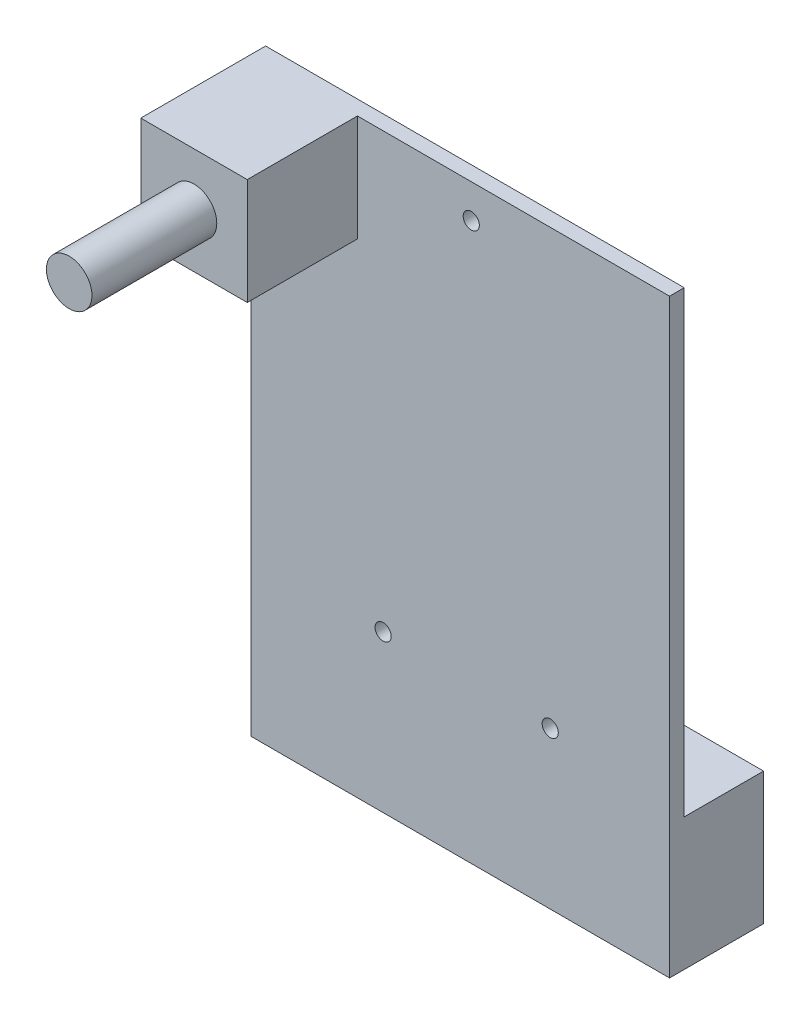
ISO-10303-21;
HEADER;
FILE_DESCRIPTION(('STEP AP214'),'2;1');
FILE_NAME('part.step','',(''),(''),'','','');
FILE_SCHEMA(('AUTOMOTIVE_DESIGN { 1 0 10303 214 1 1 1 1 }'));
ENDSEC;
DATA;
#1=APPLICATION_CONTEXT('core data for automotive mechanical design processes');
#2=APPLICATION_PROTOCOL_DEFINITION('international standard','automotive_design',2000,#1);
#3=PRODUCT_CONTEXT('',#1,'mechanical');
#4=PRODUCT('Part','Part','',(#3));
#5=PRODUCT_RELATED_PRODUCT_CATEGORY('part','',(#4));
#6=PRODUCT_DEFINITION_FORMATION('','',#4);
#7=PRODUCT_DEFINITION_CONTEXT('part definition',#1,'design');
#8=PRODUCT_DEFINITION('design','',#6,#7);
#9=PRODUCT_DEFINITION_SHAPE('','',#8);
#10=(LENGTH_UNIT() NAMED_UNIT(*) SI_UNIT(.MILLI.,.METRE.));
#11=(NAMED_UNIT(*) PLANE_ANGLE_UNIT() SI_UNIT($,.RADIAN.));
#12=(NAMED_UNIT(*) SI_UNIT($,.STERADIAN.) SOLID_ANGLE_UNIT());
#13=UNCERTAINTY_MEASURE_WITH_UNIT(LENGTH_MEASURE(1.E-05),#10,'distance_accuracy_value','');
#14=(GEOMETRIC_REPRESENTATION_CONTEXT(3) GLOBAL_UNCERTAINTY_ASSIGNED_CONTEXT((#13)) GLOBAL_UNIT_ASSIGNED_CONTEXT((#10,
#11,#12)) REPRESENTATION_CONTEXT('',''));
#15=CARTESIAN_POINT('',(0.,0.,0.));
#16=DIRECTION('',(0.,0.,1.));
#17=DIRECTION('',(1.,0.,0.));
#18=AXIS2_PLACEMENT_3D('',#15,#16,#17);
#19=CARTESIAN_POINT('',(-28.5,-40.2,17.));
#20=DIRECTION('',(0.,1.,0.));
#21=DIRECTION('',(0.,0.,1.));
#22=AXIS2_PLACEMENT_3D('',#19,#20,#21);
#23=PLANE('',#22);
#24=DIRECTION('',(1.,0.,0.));
#25=VECTOR('',#24,1.);
#26=CARTESIAN_POINT('',(-28.5,-40.2,2.));
#27=LINE('',#26,#25);
#28=CARTESIAN_POINT('',(-28.5,-40.2,2.));
#29=VERTEX_POINT('',#28);
#30=CARTESIAN_POINT('',(28.5,-40.2,2.));
#31=VERTEX_POINT('',#30);
#32=EDGE_CURVE('E145',#29,#31,#27,.T.);
#33=ORIENTED_EDGE('',*,*,#32,.F.);
#34=DIRECTION('',(0.,0.,-1.));
#35=VECTOR('',#34,1.);
#36=CARTESIAN_POINT('',(-28.5,-40.2,17.));
#37=LINE('',#36,#35);
#38=CARTESIAN_POINT('',(-28.5,-40.2,-10.8));
#39=VERTEX_POINT('',#38);
#40=EDGE_CURVE('E180',#29,#39,#37,.T.);
#41=ORIENTED_EDGE('',*,*,#40,.T.);
#42=DIRECTION('',(1.,0.,0.));
#43=VECTOR('',#42,1.);
#44=CARTESIAN_POINT('',(-28.5,-40.2,-10.8));
#45=LINE('',#44,#43);
#46=CARTESIAN_POINT('',(28.5,-40.2,-10.8));
#47=VERTEX_POINT('',#46);
#48=EDGE_CURVE('E153',#39,#47,#45,.T.);
#49=ORIENTED_EDGE('',*,*,#48,.T.);
#50=DIRECTION('',(0.,0.,-1.));
#51=VECTOR('',#50,1.);
#52=CARTESIAN_POINT('',(28.5,-40.2,17.));
#53=LINE('',#52,#51);
#54=EDGE_CURVE('E12',#31,#47,#53,.T.);
#55=ORIENTED_EDGE('',*,*,#54,.F.);
#56=EDGE_LOOP('',(#33,#41,#49,#55));
#57=FACE_BOUND('',#56,.T.);
#58=ADVANCED_FACE('F49',(#57),#23,.F.);
#59=CARTESIAN_POINT('',(28.5,-40.2,17.));
#60=DIRECTION('',(-1.,0.,0.));
#61=DIRECTION('',(0.,0.,1.));
#62=AXIS2_PLACEMENT_3D('',#59,#60,#61);
#63=PLANE('',#62);
#64=DIRECTION('',(0.,1.,0.));
#65=VECTOR('',#64,1.);
#66=CARTESIAN_POINT('',(28.5,-40.2,2.));
#67=LINE('',#66,#65);
#68=CARTESIAN_POINT('',(28.5,40.2,2.));
#69=VERTEX_POINT('',#68);
#70=EDGE_CURVE('E133',#31,#69,#67,.T.);
#71=ORIENTED_EDGE('',*,*,#70,.F.);
#72=ORIENTED_EDGE('',*,*,#54,.T.);
#73=DIRECTION('',(0.,1.,0.));
#74=VECTOR('',#73,1.);
#75=CARTESIAN_POINT('',(28.5,-40.2,-10.8));
#76=LINE('',#75,#74);
#77=CARTESIAN_POINT('',(28.5,-22.2,-10.8));
#78=VERTEX_POINT('',#77);
#79=EDGE_CURVE('E149',#47,#78,#76,.T.);
#80=ORIENTED_EDGE('',*,*,#79,.T.);
#81=DIRECTION('',(0.,0.,1.));
#82=VECTOR('',#81,1.);
#83=CARTESIAN_POINT('',(28.5,-22.2,-98.3745765355138));
#84=LINE('',#83,#82);
#85=CARTESIAN_POINT('',(28.5,-22.2,0.));
#86=VERTEX_POINT('',#85);
#87=EDGE_CURVE('E161',#78,#86,#84,.T.);
#88=ORIENTED_EDGE('',*,*,#87,.T.);
#89=DIRECTION('',(0.,1.,0.));
#90=VECTOR('',#89,1.);
#91=CARTESIAN_POINT('',(28.5,-40.2,0.));
#92=LINE('',#91,#90);
#93=CARTESIAN_POINT('',(28.5,40.2,0.));
#94=VERTEX_POINT('',#93);
#95=EDGE_CURVE('E172',#86,#94,#92,.T.);
#96=ORIENTED_EDGE('',*,*,#95,.T.);
#97=DIRECTION('',(0.,0.,-1.));
#98=VECTOR('',#97,1.);
#99=CARTESIAN_POINT('',(28.5,40.2,17.));
#100=LINE('',#99,#98);
#101=EDGE_CURVE('E57',#69,#94,#100,.T.);
#102=ORIENTED_EDGE('',*,*,#101,.F.);
#103=EDGE_LOOP('',(#71,#72,#80,#88,#96,#102));
#104=FACE_BOUND('',#103,.T.);
#105=ADVANCED_FACE('F231',(#104),#63,.F.);
#106=CARTESIAN_POINT('',(0.,0.,0.));
#107=DIRECTION('',(0.,0.,1.));
#108=DIRECTION('',(1.,0.,0.));
#109=AXIS2_PLACEMENT_3D('',#106,#107,#108);
#110=PLANE('',#109);
#111=CARTESIAN_POINT('',(1.49999999999999,35.6,0.));
#112=DIRECTION('',(0.,0.,1.));
#113=DIRECTION('',(1.,0.,0.));
#114=AXIS2_PLACEMENT_3D('',#111,#112,#113);
#115=CIRCLE('',#114,1.1);
#116=CARTESIAN_POINT('',(2.59999999999999,35.6,0.));
#117=VERTEX_POINT('',#116);
#118=EDGE_CURVE('E206',#117,#117,#115,.T.);
#119=ORIENTED_EDGE('',*,*,#118,.T.);
#120=EDGE_LOOP('',(#119));
#121=FACE_BOUND('',#120,.T.);
#122=CARTESIAN_POINT('',(-10.5,-18.8772505463019,0.));
#123=DIRECTION('',(0.,0.,1.));
#124=DIRECTION('',(1.,0.,0.));
#125=AXIS2_PLACEMENT_3D('',#122,#123,#124);
#126=CIRCLE('',#125,1.1);
#127=CARTESIAN_POINT('',(-9.40000000000001,-18.8772505463019,0.));
#128=VERTEX_POINT('',#127);
#129=EDGE_CURVE('E196',#128,#128,#126,.T.);
#130=ORIENTED_EDGE('',*,*,#129,.T.);
#131=EDGE_LOOP('',(#130));
#132=FACE_BOUND('',#131,.T.);
#133=CARTESIAN_POINT('',(12.2499992716912,-18.8714939804325,0.));
#134=DIRECTION('',(0.,0.,1.));
#135=DIRECTION('',(1.,0.,0.));
#136=AXIS2_PLACEMENT_3D('',#133,#134,#135);
#137=CIRCLE('',#136,1.1);
#138=CARTESIAN_POINT('',(13.3499992716912,-18.8714939804325,0.));
#139=VERTEX_POINT('',#138);
#140=EDGE_CURVE('E193',#139,#139,#137,.T.);
#141=ORIENTED_EDGE('',*,*,#140,.T.);
#142=EDGE_LOOP('',(#141));
#143=FACE_BOUND('',#142,.T.);
#144=DIRECTION('',(1.,0.,0.));
#145=VECTOR('',#144,1.);
#146=CARTESIAN_POINT('',(-28.5,-22.2,0.));
#147=LINE('',#146,#145);
#148=CARTESIAN_POINT('',(-28.5,-22.2,0.));
#149=VERTEX_POINT('',#148);
#150=EDGE_CURVE('E73',#149,#86,#147,.T.);
#151=ORIENTED_EDGE('',*,*,#150,.F.);
#152=DIRECTION('',(0.,-1.,0.));
#153=VECTOR('',#152,1.);
#154=CARTESIAN_POINT('',(-28.5,-40.2,0.));
#155=LINE('',#154,#153);
#156=CARTESIAN_POINT('',(-28.5,40.2,0.));
#157=VERTEX_POINT('',#156);
#158=EDGE_CURVE('E177',#157,#149,#155,.T.);
#159=ORIENTED_EDGE('',*,*,#158,.F.);
#160=DIRECTION('',(-1.,0.,0.));
#161=VECTOR('',#160,1.);
#162=CARTESIAN_POINT('',(-28.5,40.2,0.));
#163=LINE('',#162,#161);
#164=EDGE_CURVE('E183',#94,#157,#163,.T.);
#165=ORIENTED_EDGE('',*,*,#164,.F.);
#166=ORIENTED_EDGE('',*,*,#95,.F.);
#167=EDGE_LOOP('',(#151,#159,#165,#166));
#168=FACE_BOUND('',#167,.T.);
#169=ADVANCED_FACE('F228',(#121,#132,#143,#168),#110,.F.);
#170=CARTESIAN_POINT('',(-28.5,40.2,17.));
#171=DIRECTION('',(0.,-1.,0.));
#172=DIRECTION('',(0.,0.,-1.));
#173=AXIS2_PLACEMENT_3D('',#170,#171,#172);
#174=PLANE('',#173);
#175=DIRECTION('',(-1.,0.,0.));
#176=VECTOR('',#175,1.);
#177=CARTESIAN_POINT('',(-28.5,40.2,17.));
#178=LINE('',#177,#176);
#179=CARTESIAN_POINT('',(-14.,40.2,17.));
#180=VERTEX_POINT('',#179);
#181=CARTESIAN_POINT('',(-28.5,40.2,17.));
#182=VERTEX_POINT('',#181);
#183=EDGE_CURVE('E141',#180,#182,#178,.T.);
#184=ORIENTED_EDGE('',*,*,#183,.F.);
#185=DIRECTION('',(0.,0.,1.));
#186=VECTOR('',#185,1.);
#187=CARTESIAN_POINT('',(-14.,40.2,2.));
#188=LINE('',#187,#186);
#189=CARTESIAN_POINT('',(-14.,40.2,2.));
#190=VERTEX_POINT('',#189);
#191=EDGE_CURVE('E65',#190,#180,#188,.T.);
#192=ORIENTED_EDGE('',*,*,#191,.F.);
#193=DIRECTION('',(-1.,0.,0.));
#194=VECTOR('',#193,1.);
#195=CARTESIAN_POINT('',(28.5,40.2,2.));
#196=LINE('',#195,#194);
#197=EDGE_CURVE('E128',#69,#190,#196,.T.);
#198=ORIENTED_EDGE('',*,*,#197,.F.);
#199=ORIENTED_EDGE('',*,*,#101,.T.);
#200=ORIENTED_EDGE('',*,*,#164,.T.);
#201=DIRECTION('',(0.,0.,-1.));
#202=VECTOR('',#201,1.);
#203=CARTESIAN_POINT('',(-28.5,40.2,17.));
#204=LINE('',#203,#202);
#205=EDGE_CURVE('E187',#182,#157,#204,.T.);
#206=ORIENTED_EDGE('',*,*,#205,.F.);
#207=EDGE_LOOP('',(#184,#192,#198,#199,#200,#206));
#208=FACE_BOUND('',#207,.T.);
#209=ADVANCED_FACE('F139',(#208),#174,.F.);
#210=CARTESIAN_POINT('',(-28.5,-40.2,17.));
#211=DIRECTION('',(1.,0.,0.));
#212=DIRECTION('',(0.,0.,-1.));
#213=AXIS2_PLACEMENT_3D('',#210,#211,#212);
#214=PLANE('',#213);
#215=DIRECTION('',(0.,-1.,0.));
#216=VECTOR('',#215,1.);
#217=CARTESIAN_POINT('',(-28.5,25.7,2.));
#218=LINE('',#217,#216);
#219=CARTESIAN_POINT('',(-28.5,25.7,2.));
#220=VERTEX_POINT('',#219);
#221=EDGE_CURVE('E211',#220,#29,#218,.T.);
#222=ORIENTED_EDGE('',*,*,#221,.F.);
#223=DIRECTION('',(0.,0.,1.));
#224=VECTOR('',#223,1.);
#225=CARTESIAN_POINT('',(-28.5,25.7,2.));
#226=LINE('',#225,#224);
#227=CARTESIAN_POINT('',(-28.5,25.7,17.));
#228=VERTEX_POINT('',#227);
#229=EDGE_CURVE('E143',#220,#228,#226,.T.);
#230=ORIENTED_EDGE('',*,*,#229,.T.);
#231=DIRECTION('',(0.,-1.,0.));
#232=VECTOR('',#231,1.);
#233=CARTESIAN_POINT('',(-28.5,-40.2,17.));
#234=LINE('',#233,#232);
#235=EDGE_CURVE('E176',#182,#228,#234,.T.);
#236=ORIENTED_EDGE('',*,*,#235,.F.);
#237=ORIENTED_EDGE('',*,*,#205,.T.);
#238=ORIENTED_EDGE('',*,*,#158,.T.);
#239=DIRECTION('',(0.,0.,1.));
#240=VECTOR('',#239,1.);
#241=CARTESIAN_POINT('',(-28.5,-22.2,-98.3745765355138));
#242=LINE('',#241,#240);
#243=CARTESIAN_POINT('',(-28.5,-22.2,-10.8));
#244=VERTEX_POINT('',#243);
#245=EDGE_CURVE('E164',#244,#149,#242,.T.);
#246=ORIENTED_EDGE('',*,*,#245,.F.);
#247=DIRECTION('',(0.,-1.,0.));
#248=VECTOR('',#247,1.);
#249=CARTESIAN_POINT('',(-28.5,-40.2,-10.8));
#250=LINE('',#249,#248);
#251=EDGE_CURVE('E156',#244,#39,#250,.T.);
#252=ORIENTED_EDGE('',*,*,#251,.T.);
#253=ORIENTED_EDGE('',*,*,#40,.F.);
#254=EDGE_LOOP('',(#222,#230,#236,#237,#238,#246,#252,#253));
#255=FACE_BOUND('',#254,.T.);
#256=ADVANCED_FACE('F219',(#255),#214,.F.);
#257=CARTESIAN_POINT('',(0.,0.,17.));
#258=DIRECTION('',(0.,0.,1.));
#259=DIRECTION('',(1.,0.,0.));
#260=AXIS2_PLACEMENT_3D('',#257,#258,#259);
#261=PLANE('',#260);
#262=DIRECTION('',(-1.,0.,0.));
#263=VECTOR('',#262,1.);
#264=CARTESIAN_POINT('',(-14.,25.7,17.));
#265=LINE('',#264,#263);
#266=CARTESIAN_POINT('',(-14.,25.7,17.));
#267=VERTEX_POINT('',#266);
#268=EDGE_CURVE('E136',#267,#228,#265,.T.);
#269=ORIENTED_EDGE('',*,*,#268,.F.);
#270=DIRECTION('',(0.,-1.,0.));
#271=VECTOR('',#270,1.);
#272=CARTESIAN_POINT('',(-14.,40.2,17.));
#273=LINE('',#272,#271);
#274=EDGE_CURVE('E208',#180,#267,#273,.T.);
#275=ORIENTED_EDGE('',*,*,#274,.F.);
#276=ORIENTED_EDGE('',*,*,#183,.T.);
#277=ORIENTED_EDGE('',*,*,#235,.T.);
#278=EDGE_LOOP('',(#269,#275,#276,#277));
#279=FACE_BOUND('',#278,.T.);
#280=CARTESIAN_POINT('',(-21.25,32.95,17.));
#281=DIRECTION('',(0.,0.,1.));
#282=DIRECTION('',(1.,0.,0.));
#283=AXIS2_PLACEMENT_3D('',#280,#281,#282);
#284=CIRCLE('',#283,3.1);
#285=CARTESIAN_POINT('',(-18.15,32.95,17.));
#286=VERTEX_POINT('',#285);
#287=EDGE_CURVE('E159',#286,#286,#284,.T.);
#288=ORIENTED_EDGE('',*,*,#287,.F.);
#289=EDGE_LOOP('',(#288));
#290=FACE_BOUND('',#289,.T.);
#291=ADVANCED_FACE('F224',(#279,#290),#261,.T.);
#292=CARTESIAN_POINT('',(-21.25,32.95,34.));
#293=DIRECTION('',(0.,0.,-1.));
#294=DIRECTION('',(-1.,0.,0.));
#295=AXIS2_PLACEMENT_3D('',#292,#293,#294);
#296=CYLINDRICAL_SURFACE('',#295,3.1);
#297=CARTESIAN_POINT('',(-21.25,32.95,34.));
#298=DIRECTION('',(0.,0.,1.));
#299=DIRECTION('',(1.,0.,0.));
#300=AXIS2_PLACEMENT_3D('',#297,#298,#299);
#301=CIRCLE('',#300,3.1);
#302=CARTESIAN_POINT('',(-18.15,32.95,34.));
#303=VERTEX_POINT('',#302);
#304=EDGE_CURVE('E169',#303,#303,#301,.T.);
#305=ORIENTED_EDGE('',*,*,#304,.F.);
#306=EDGE_LOOP('',(#305));
#307=FACE_BOUND('',#306,.T.);
#308=ORIENTED_EDGE('',*,*,#287,.T.);
#309=EDGE_LOOP('',(#308));
#310=FACE_BOUND('',#309,.T.);
#311=ADVANCED_FACE('F268',(#307,#310),#296,.T.);
#312=CARTESIAN_POINT('',(0.,0.,34.));
#313=DIRECTION('',(0.,0.,1.));
#314=DIRECTION('',(1.,0.,0.));
#315=AXIS2_PLACEMENT_3D('',#312,#313,#314);
#316=PLANE('',#315);
#317=ORIENTED_EDGE('',*,*,#304,.T.);
#318=EDGE_LOOP('',(#317));
#319=FACE_BOUND('',#318,.T.);
#320=ADVANCED_FACE('F271',(#319),#316,.T.);
#321=CARTESIAN_POINT('',(-28.5,-22.2,-98.3745765355138));
#322=DIRECTION('',(0.,-1.,0.));
#323=DIRECTION('',(0.,0.,-1.));
#324=AXIS2_PLACEMENT_3D('',#321,#322,#323);
#325=PLANE('',#324);
#326=ORIENTED_EDGE('',*,*,#87,.F.);
#327=DIRECTION('',(-1.,0.,0.));
#328=VECTOR('',#327,1.);
#329=CARTESIAN_POINT('',(-28.5,-22.2,-10.8));
#330=LINE('',#329,#328);
#331=EDGE_CURVE('E152',#78,#244,#330,.T.);
#332=ORIENTED_EDGE('',*,*,#331,.T.);
#333=ORIENTED_EDGE('',*,*,#245,.T.);
#334=ORIENTED_EDGE('',*,*,#150,.T.);
#335=EDGE_LOOP('',(#326,#332,#333,#334));
#336=FACE_BOUND('',#335,.T.);
#337=ADVANCED_FACE('F234',(#336),#325,.F.);
#338=CARTESIAN_POINT('',(0.,0.,-10.8));
#339=DIRECTION('',(0.,0.,1.));
#340=DIRECTION('',(1.,0.,0.));
#341=AXIS2_PLACEMENT_3D('',#338,#339,#340);
#342=PLANE('',#341);
#343=ORIENTED_EDGE('',*,*,#331,.F.);
#344=ORIENTED_EDGE('',*,*,#79,.F.);
#345=ORIENTED_EDGE('',*,*,#48,.F.);
#346=ORIENTED_EDGE('',*,*,#251,.F.);
#347=EDGE_LOOP('',(#343,#344,#345,#346));
#348=FACE_BOUND('',#347,.T.);
#349=ADVANCED_FACE('F237',(#348),#342,.F.);
#350=CARTESIAN_POINT('',(-14.,25.7,2.));
#351=DIRECTION('',(0.,1.,0.));
#352=DIRECTION('',(0.,0.,1.));
#353=AXIS2_PLACEMENT_3D('',#350,#351,#352);
#354=PLANE('',#353);
#355=ORIENTED_EDGE('',*,*,#268,.T.);
#356=ORIENTED_EDGE('',*,*,#229,.F.);
#357=DIRECTION('',(-1.,0.,0.));
#358=VECTOR('',#357,1.);
#359=CARTESIAN_POINT('',(-14.,25.7,2.));
#360=LINE('',#359,#358);
#361=CARTESIAN_POINT('',(-14.,25.7,2.));
#362=VERTEX_POINT('',#361);
#363=EDGE_CURVE('E127',#362,#220,#360,.T.);
#364=ORIENTED_EDGE('',*,*,#363,.F.);
#365=DIRECTION('',(0.,0.,1.));
#366=VECTOR('',#365,1.);
#367=CARTESIAN_POINT('',(-14.,25.7,2.));
#368=LINE('',#367,#366);
#369=EDGE_CURVE('E123',#362,#267,#368,.T.);
#370=ORIENTED_EDGE('',*,*,#369,.T.);
#371=EDGE_LOOP('',(#355,#356,#364,#370));
#372=FACE_BOUND('',#371,.T.);
#373=ADVANCED_FACE('F241',(#372),#354,.F.);
#374=CARTESIAN_POINT('',(-14.,40.2,2.));
#375=DIRECTION('',(-1.,0.,0.));
#376=DIRECTION('',(0.,-1.,0.));
#377=AXIS2_PLACEMENT_3D('',#374,#375,#376);
#378=PLANE('',#377);
#379=ORIENTED_EDGE('',*,*,#274,.T.);
#380=ORIENTED_EDGE('',*,*,#369,.F.);
#381=DIRECTION('',(0.,-1.,0.));
#382=VECTOR('',#381,1.);
#383=CARTESIAN_POINT('',(-14.,40.2,2.));
#384=LINE('',#383,#382);
#385=EDGE_CURVE('E120',#190,#362,#384,.T.);
#386=ORIENTED_EDGE('',*,*,#385,.F.);
#387=ORIENTED_EDGE('',*,*,#191,.T.);
#388=EDGE_LOOP('',(#379,#380,#386,#387));
#389=FACE_BOUND('',#388,.T.);
#390=ADVANCED_FACE('F122',(#389),#378,.F.);
#391=CARTESIAN_POINT('',(0.,0.,2.));
#392=DIRECTION('',(0.,0.,1.));
#393=DIRECTION('',(1.,0.,0.));
#394=AXIS2_PLACEMENT_3D('',#391,#392,#393);
#395=PLANE('',#394);
#396=CARTESIAN_POINT('',(1.49999999999999,35.6,2.));
#397=DIRECTION('',(0.,0.,1.));
#398=DIRECTION('',(1.,0.,0.));
#399=AXIS2_PLACEMENT_3D('',#396,#397,#398);
#400=CIRCLE('',#399,1.1);
#401=CARTESIAN_POINT('',(2.59999999999999,35.6,2.));
#402=VERTEX_POINT('',#401);
#403=EDGE_CURVE('E52',#402,#402,#400,.T.);
#404=ORIENTED_EDGE('',*,*,#403,.F.);
#405=EDGE_LOOP('',(#404));
#406=FACE_BOUND('',#405,.T.);
#407=CARTESIAN_POINT('',(-10.5,-18.8772505463019,2.));
#408=DIRECTION('',(0.,0.,1.));
#409=DIRECTION('',(1.,0.,0.));
#410=AXIS2_PLACEMENT_3D('',#407,#408,#409);
#411=CIRCLE('',#410,1.1);
#412=CARTESIAN_POINT('',(-9.40000000000001,-18.8772505463019,2.));
#413=VERTEX_POINT('',#412);
#414=EDGE_CURVE('E194',#413,#413,#411,.T.);
#415=ORIENTED_EDGE('',*,*,#414,.F.);
#416=EDGE_LOOP('',(#415));
#417=FACE_BOUND('',#416,.T.);
#418=CARTESIAN_POINT('',(12.2499992716912,-18.8714939804325,2.));
#419=DIRECTION('',(0.,0.,1.));
#420=DIRECTION('',(1.,0.,0.));
#421=AXIS2_PLACEMENT_3D('',#418,#419,#420);
#422=CIRCLE('',#421,1.1);
#423=CARTESIAN_POINT('',(13.3499992716912,-18.8714939804325,2.));
#424=VERTEX_POINT('',#423);
#425=EDGE_CURVE('E191',#424,#424,#422,.T.);
#426=ORIENTED_EDGE('',*,*,#425,.F.);
#427=EDGE_LOOP('',(#426));
#428=FACE_BOUND('',#427,.T.);
#429=ORIENTED_EDGE('',*,*,#197,.T.);
#430=ORIENTED_EDGE('',*,*,#385,.T.);
#431=ORIENTED_EDGE('',*,*,#363,.T.);
#432=ORIENTED_EDGE('',*,*,#221,.T.);
#433=ORIENTED_EDGE('',*,*,#32,.T.);
#434=ORIENTED_EDGE('',*,*,#70,.T.);
#435=EDGE_LOOP('',(#429,#430,#431,#432,#433,#434));
#436=FACE_BOUND('',#435,.T.);
#437=ADVANCED_FACE('F131',(#406,#417,#428,#436),#395,.T.);
#438=CARTESIAN_POINT('',(12.2499992716912,-18.8714939804325,34.));
#439=DIRECTION('',(0.,0.,-1.));
#440=DIRECTION('',(-1.,0.,0.));
#441=AXIS2_PLACEMENT_3D('',#438,#439,#440);
#442=CYLINDRICAL_SURFACE('',#441,1.1);
#443=ORIENTED_EDGE('',*,*,#425,.T.);
#444=EDGE_LOOP('',(#443));
#445=FACE_BOUND('',#444,.T.);
#446=ORIENTED_EDGE('',*,*,#140,.F.);
#447=EDGE_LOOP('',(#446));
#448=FACE_BOUND('',#447,.T.);
#449=ADVANCED_FACE('F306',(#445,#448),#442,.F.);
#450=CARTESIAN_POINT('',(-10.5,-18.8772505463019,34.));
#451=DIRECTION('',(0.,0.,-1.));
#452=DIRECTION('',(-1.,0.,0.));
#453=AXIS2_PLACEMENT_3D('',#450,#451,#452);
#454=CYLINDRICAL_SURFACE('',#453,1.1);
#455=ORIENTED_EDGE('',*,*,#414,.T.);
#456=EDGE_LOOP('',(#455));
#457=FACE_BOUND('',#456,.T.);
#458=ORIENTED_EDGE('',*,*,#129,.F.);
#459=EDGE_LOOP('',(#458));
#460=FACE_BOUND('',#459,.T.);
#461=ADVANCED_FACE('F319',(#457,#460),#454,.F.);
#462=CARTESIAN_POINT('',(1.49999999999999,35.6,34.));
#463=DIRECTION('',(0.,0.,-1.));
#464=DIRECTION('',(-1.,0.,0.));
#465=AXIS2_PLACEMENT_3D('',#462,#463,#464);
#466=CYLINDRICAL_SURFACE('',#465,1.1);
#467=ORIENTED_EDGE('',*,*,#403,.T.);
#468=EDGE_LOOP('',(#467));
#469=FACE_BOUND('',#468,.T.);
#470=ORIENTED_EDGE('',*,*,#118,.F.);
#471=EDGE_LOOP('',(#470));
#472=FACE_BOUND('',#471,.T.);
#473=ADVANCED_FACE('F328',(#469,#472),#466,.F.);
#474=CLOSED_SHELL('',(#58,#105,#169,#209,#256,#291,#311,#320,#337,#349,#373,#390,#437,#449,#461,#473));
#475=MANIFOLD_SOLID_BREP('B2',#474);
#476=ADVANCED_BREP_SHAPE_REPRESENTATION('',(#18,#475),#14);
#477=SHAPE_DEFINITION_REPRESENTATION(#9,#476);
ENDSEC;
END-ISO-10303-21;
